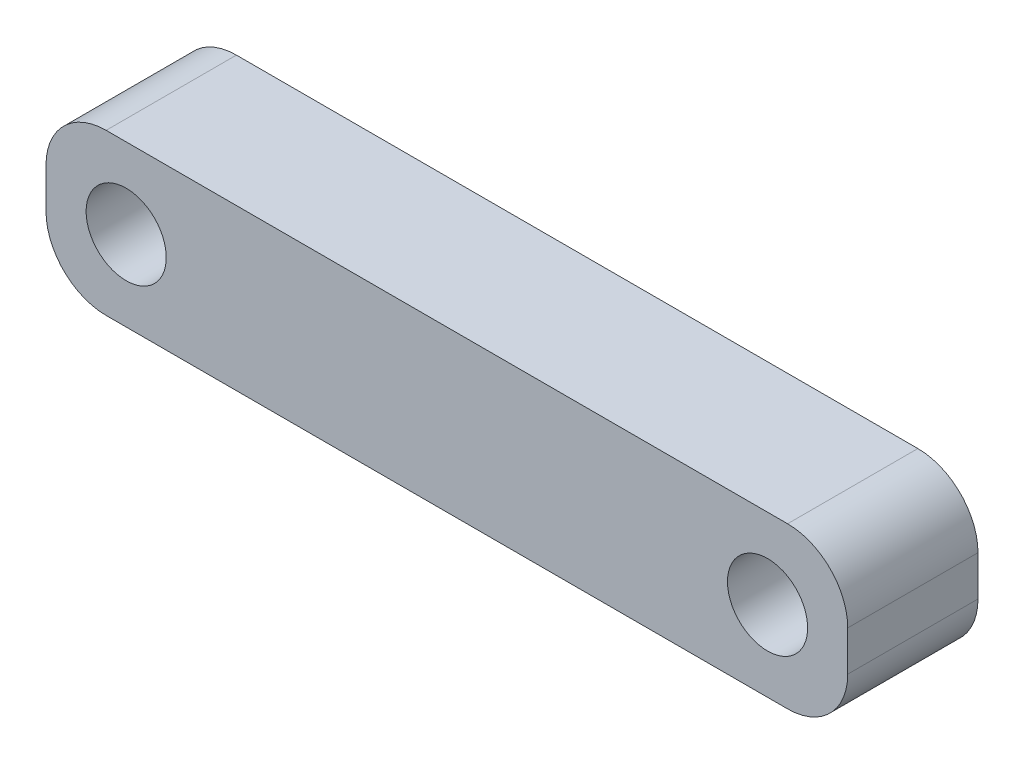
ISO-10303-21;
HEADER;
FILE_DESCRIPTION(('STEP AP214'),'2;1');
FILE_NAME('part.step','',(''),(''),'','','');
FILE_SCHEMA(('AUTOMOTIVE_DESIGN { 1 0 10303 214 1 1 1 1 }'));
ENDSEC;
DATA;
#1=APPLICATION_CONTEXT('core data for automotive mechanical design processes');
#2=APPLICATION_PROTOCOL_DEFINITION('international standard','automotive_design',2000,#1);
#3=PRODUCT_CONTEXT('',#1,'mechanical');
#4=PRODUCT('Part','Part','',(#3));
#5=PRODUCT_RELATED_PRODUCT_CATEGORY('part','',(#4));
#6=PRODUCT_DEFINITION_FORMATION('','',#4);
#7=PRODUCT_DEFINITION_CONTEXT('part definition',#1,'design');
#8=PRODUCT_DEFINITION('design','',#6,#7);
#9=PRODUCT_DEFINITION_SHAPE('','',#8);
#10=(LENGTH_UNIT() NAMED_UNIT(*) SI_UNIT(.MILLI.,.METRE.));
#11=(NAMED_UNIT(*) PLANE_ANGLE_UNIT() SI_UNIT($,.RADIAN.));
#12=(NAMED_UNIT(*) SI_UNIT($,.STERADIAN.) SOLID_ANGLE_UNIT());
#13=UNCERTAINTY_MEASURE_WITH_UNIT(LENGTH_MEASURE(1.E-05),#10,'distance_accuracy_value','');
#14=(GEOMETRIC_REPRESENTATION_CONTEXT(3) GLOBAL_UNCERTAINTY_ASSIGNED_CONTEXT((#13)) GLOBAL_UNIT_ASSIGNED_CONTEXT((#10,
#11,#12)) REPRESENTATION_CONTEXT('',''));
#15=CARTESIAN_POINT('',(0.,0.,0.));
#16=DIRECTION('',(0.,0.,1.));
#17=DIRECTION('',(1.,0.,0.));
#18=AXIS2_PLACEMENT_3D('',#15,#16,#17);
#19=CARTESIAN_POINT('',(34.,-1.99999999999998,13.));
#20=DIRECTION('',(0.,0.,1.));
#21=DIRECTION('',(1.,0.,0.));
#22=AXIS2_PLACEMENT_3D('',#19,#20,#21);
#23=PLANE('',#22);
#24=CARTESIAN_POINT('',(-32.,0.,13.));
#25=DIRECTION('',(0.,0.,1.));
#26=DIRECTION('',(1.,0.,0.));
#27=AXIS2_PLACEMENT_3D('',#24,#25,#26);
#28=CIRCLE('',#27,4.);
#29=CARTESIAN_POINT('',(-36.,0.,13.));
#30=VERTEX_POINT('',#29);
#31=EDGE_CURVE('E134',#30,#30,#28,.T.);
#32=ORIENTED_EDGE('',*,*,#31,.F.);
#33=EDGE_LOOP('',(#32));
#34=FACE_BOUND('',#33,.T.);
#35=CARTESIAN_POINT('',(34.,-1.99999999999998,13.));
#36=DIRECTION('',(0.,0.,1.));
#37=DIRECTION('',(1.,0.,0.));
#38=AXIS2_PLACEMENT_3D('',#35,#36,#37);
#39=CIRCLE('',#38,5.99999999999999);
#40=CARTESIAN_POINT('',(34.,-7.99999999999997,13.));
#41=VERTEX_POINT('',#40);
#42=CARTESIAN_POINT('',(40.,-1.99999999999998,13.));
#43=VERTEX_POINT('',#42);
#44=EDGE_CURVE('E145',#41,#43,#39,.T.);
#45=ORIENTED_EDGE('',*,*,#44,.T.);
#46=DIRECTION('',(0.,1.,0.));
#47=VECTOR('',#46,1.);
#48=CARTESIAN_POINT('',(40.,-1.99999999999998,13.));
#49=LINE('',#48,#47);
#50=CARTESIAN_POINT('',(40.,2.00000000000003,13.));
#51=VERTEX_POINT('',#50);
#52=EDGE_CURVE('E93',#43,#51,#49,.T.);
#53=ORIENTED_EDGE('',*,*,#52,.T.);
#54=CARTESIAN_POINT('',(34.,2.00000000000003,13.));
#55=DIRECTION('',(0.,0.,1.));
#56=DIRECTION('',(-1.,0.,0.));
#57=AXIS2_PLACEMENT_3D('',#54,#55,#56);
#58=CIRCLE('',#57,6.);
#59=CARTESIAN_POINT('',(34.,8.00000000000003,13.));
#60=VERTEX_POINT('',#59);
#61=EDGE_CURVE('E160',#51,#60,#58,.T.);
#62=ORIENTED_EDGE('',*,*,#61,.T.);
#63=DIRECTION('',(-1.,0.,0.));
#64=VECTOR('',#63,1.);
#65=CARTESIAN_POINT('',(-34.,8.00000000000002,13.));
#66=LINE('',#65,#64);
#67=CARTESIAN_POINT('',(-34.,8.00000000000002,13.));
#68=VERTEX_POINT('',#67);
#69=EDGE_CURVE('E173',#60,#68,#66,.T.);
#70=ORIENTED_EDGE('',*,*,#69,.T.);
#71=CARTESIAN_POINT('',(-34.,2.00000000000002,13.));
#72=DIRECTION('',(0.,0.,1.));
#73=DIRECTION('',(-1.,0.,0.));
#74=AXIS2_PLACEMENT_3D('',#71,#72,#73);
#75=CIRCLE('',#74,6.);
#76=CARTESIAN_POINT('',(-40.,2.00000000000002,13.));
#77=VERTEX_POINT('',#76);
#78=EDGE_CURVE('E112',#68,#77,#75,.T.);
#79=ORIENTED_EDGE('',*,*,#78,.T.);
#80=DIRECTION('',(0.,-1.,0.));
#81=VECTOR('',#80,1.);
#82=CARTESIAN_POINT('',(-40.,-1.99999999999999,13.));
#83=LINE('',#82,#81);
#84=CARTESIAN_POINT('',(-40.,-1.99999999999999,13.));
#85=VERTEX_POINT('',#84);
#86=EDGE_CURVE('E106',#77,#85,#83,.T.);
#87=ORIENTED_EDGE('',*,*,#86,.T.);
#88=CARTESIAN_POINT('',(-34.,-1.99999999999999,13.));
#89=DIRECTION('',(0.,0.,1.));
#90=DIRECTION('',(-1.,0.,0.));
#91=AXIS2_PLACEMENT_3D('',#88,#89,#90);
#92=CIRCLE('',#91,5.99999999999999);
#93=CARTESIAN_POINT('',(-34.,-7.99999999999998,13.));
#94=VERTEX_POINT('',#93);
#95=EDGE_CURVE('E110',#85,#94,#92,.T.);
#96=ORIENTED_EDGE('',*,*,#95,.T.);
#97=DIRECTION('',(1.,0.,0.));
#98=VECTOR('',#97,1.);
#99=CARTESIAN_POINT('',(-34.,-7.99999999999998,13.));
#100=LINE('',#99,#98);
#101=EDGE_CURVE('E50',#94,#41,#100,.T.);
#102=ORIENTED_EDGE('',*,*,#101,.T.);
#103=EDGE_LOOP('',(#45,#53,#62,#70,#79,#87,#96,#102));
#104=FACE_BOUND('',#103,.T.);
#105=CARTESIAN_POINT('',(32.,0.,13.));
#106=DIRECTION('',(0.,0.,1.));
#107=DIRECTION('',(-1.,0.,0.));
#108=AXIS2_PLACEMENT_3D('',#105,#106,#107);
#109=CIRCLE('',#108,4.);
#110=CARTESIAN_POINT('',(28.,0.,13.));
#111=VERTEX_POINT('',#110);
#112=EDGE_CURVE('E182',#111,#111,#109,.T.);
#113=ORIENTED_EDGE('',*,*,#112,.F.);
#114=EDGE_LOOP('',(#113));
#115=FACE_BOUND('',#114,.T.);
#116=ADVANCED_FACE('F33',(#34,#104,#115),#23,.T.);
#117=CARTESIAN_POINT('',(34.,-1.99999999999998,0.));
#118=DIRECTION('',(0.,0.,1.));
#119=DIRECTION('',(1.,0.,0.));
#120=AXIS2_PLACEMENT_3D('',#117,#118,#119);
#121=PLANE('',#120);
#122=CARTESIAN_POINT('',(34.,-1.99999999999998,0.));
#123=DIRECTION('',(0.,0.,1.));
#124=DIRECTION('',(1.,0.,0.));
#125=AXIS2_PLACEMENT_3D('',#122,#123,#124);
#126=CIRCLE('',#125,5.99999999999999);
#127=CARTESIAN_POINT('',(34.,-7.99999999999997,0.));
#128=VERTEX_POINT('',#127);
#129=CARTESIAN_POINT('',(40.,-1.99999999999998,0.));
#130=VERTEX_POINT('',#129);
#131=EDGE_CURVE('E130',#128,#130,#126,.T.);
#132=ORIENTED_EDGE('',*,*,#131,.F.);
#133=DIRECTION('',(1.,0.,0.));
#134=VECTOR('',#133,1.);
#135=CARTESIAN_POINT('',(-34.,-7.99999999999998,0.));
#136=LINE('',#135,#134);
#137=CARTESIAN_POINT('',(-34.,-7.99999999999998,0.));
#138=VERTEX_POINT('',#137);
#139=EDGE_CURVE('E85',#138,#128,#136,.T.);
#140=ORIENTED_EDGE('',*,*,#139,.F.);
#141=CARTESIAN_POINT('',(-34.,-1.99999999999999,0.));
#142=DIRECTION('',(0.,0.,1.));
#143=DIRECTION('',(-1.,0.,0.));
#144=AXIS2_PLACEMENT_3D('',#141,#142,#143);
#145=CIRCLE('',#144,5.99999999999999);
#146=CARTESIAN_POINT('',(-40.,-1.99999999999999,0.));
#147=VERTEX_POINT('',#146);
#148=EDGE_CURVE('E79',#147,#138,#145,.T.);
#149=ORIENTED_EDGE('',*,*,#148,.F.);
#150=DIRECTION('',(0.,-1.,0.));
#151=VECTOR('',#150,1.);
#152=CARTESIAN_POINT('',(-40.,-1.99999999999999,0.));
#153=LINE('',#152,#151);
#154=CARTESIAN_POINT('',(-40.,2.00000000000002,0.));
#155=VERTEX_POINT('',#154);
#156=EDGE_CURVE('E120',#155,#147,#153,.T.);
#157=ORIENTED_EDGE('',*,*,#156,.F.);
#158=CARTESIAN_POINT('',(-34.,2.00000000000002,0.));
#159=DIRECTION('',(0.,0.,1.));
#160=DIRECTION('',(-1.,0.,0.));
#161=AXIS2_PLACEMENT_3D('',#158,#159,#160);
#162=CIRCLE('',#161,6.);
#163=CARTESIAN_POINT('',(-34.,8.00000000000002,0.));
#164=VERTEX_POINT('',#163);
#165=EDGE_CURVE('E140',#164,#155,#162,.T.);
#166=ORIENTED_EDGE('',*,*,#165,.F.);
#167=DIRECTION('',(-1.,0.,0.));
#168=VECTOR('',#167,1.);
#169=CARTESIAN_POINT('',(-34.,8.00000000000002,0.));
#170=LINE('',#169,#168);
#171=CARTESIAN_POINT('',(34.,8.00000000000003,0.));
#172=VERTEX_POINT('',#171);
#173=EDGE_CURVE('E138',#172,#164,#170,.T.);
#174=ORIENTED_EDGE('',*,*,#173,.F.);
#175=CARTESIAN_POINT('',(34.,2.00000000000003,0.));
#176=DIRECTION('',(0.,0.,1.));
#177=DIRECTION('',(-1.,0.,0.));
#178=AXIS2_PLACEMENT_3D('',#175,#176,#177);
#179=CIRCLE('',#178,6.);
#180=CARTESIAN_POINT('',(40.,2.00000000000003,0.));
#181=VERTEX_POINT('',#180);
#182=EDGE_CURVE('E136',#181,#172,#179,.T.);
#183=ORIENTED_EDGE('',*,*,#182,.F.);
#184=DIRECTION('',(0.,1.,0.));
#185=VECTOR('',#184,1.);
#186=CARTESIAN_POINT('',(40.,-1.99999999999998,0.));
#187=LINE('',#186,#185);
#188=EDGE_CURVE('E133',#130,#181,#187,.T.);
#189=ORIENTED_EDGE('',*,*,#188,.F.);
#190=EDGE_LOOP('',(#132,#140,#149,#157,#166,#174,#183,#189));
#191=FACE_BOUND('',#190,.T.);
#192=CARTESIAN_POINT('',(-32.,0.,0.));
#193=DIRECTION('',(0.,0.,1.));
#194=DIRECTION('',(1.,0.,0.));
#195=AXIS2_PLACEMENT_3D('',#192,#193,#194);
#196=CIRCLE('',#195,4.);
#197=CARTESIAN_POINT('',(-36.,0.,0.));
#198=VERTEX_POINT('',#197);
#199=EDGE_CURVE('E179',#198,#198,#196,.T.);
#200=ORIENTED_EDGE('',*,*,#199,.T.);
#201=EDGE_LOOP('',(#200));
#202=FACE_BOUND('',#201,.T.);
#203=CARTESIAN_POINT('',(32.,0.,0.));
#204=DIRECTION('',(0.,0.,1.));
#205=DIRECTION('',(-1.,0.,0.));
#206=AXIS2_PLACEMENT_3D('',#203,#204,#205);
#207=CIRCLE('',#206,4.);
#208=CARTESIAN_POINT('',(28.,0.,0.));
#209=VERTEX_POINT('',#208);
#210=EDGE_CURVE('E185',#209,#209,#207,.T.);
#211=ORIENTED_EDGE('',*,*,#210,.T.);
#212=EDGE_LOOP('',(#211));
#213=FACE_BOUND('',#212,.T.);
#214=ADVANCED_FACE('F164',(#191,#202,#213),#121,.F.);
#215=CARTESIAN_POINT('',(34.,-1.99999999999998,13.));
#216=DIRECTION('',(0.,0.,-1.));
#217=DIRECTION('',(-1.,0.,0.));
#218=AXIS2_PLACEMENT_3D('',#215,#216,#217);
#219=CYLINDRICAL_SURFACE('',#218,5.99999999999999);
#220=ORIENTED_EDGE('',*,*,#131,.T.);
#221=DIRECTION('',(0.,0.,-1.));
#222=VECTOR('',#221,1.);
#223=CARTESIAN_POINT('',(40.,-1.99999999999998,13.));
#224=LINE('',#223,#222);
#225=EDGE_CURVE('E11',#43,#130,#224,.T.);
#226=ORIENTED_EDGE('',*,*,#225,.F.);
#227=ORIENTED_EDGE('',*,*,#44,.F.);
#228=DIRECTION('',(0.,0.,-1.));
#229=VECTOR('',#228,1.);
#230=CARTESIAN_POINT('',(34.,-7.99999999999997,13.));
#231=LINE('',#230,#229);
#232=EDGE_CURVE('E126',#41,#128,#231,.T.);
#233=ORIENTED_EDGE('',*,*,#232,.T.);
#234=EDGE_LOOP('',(#220,#226,#227,#233));
#235=FACE_BOUND('',#234,.T.);
#236=ADVANCED_FACE('F35',(#235),#219,.T.);
#237=CARTESIAN_POINT('',(40.,-1.99999999999998,13.));
#238=DIRECTION('',(-1.,0.,0.));
#239=DIRECTION('',(0.,0.,1.));
#240=AXIS2_PLACEMENT_3D('',#237,#238,#239);
#241=PLANE('',#240);
#242=ORIENTED_EDGE('',*,*,#188,.T.);
#243=DIRECTION('',(0.,0.,-1.));
#244=VECTOR('',#243,1.);
#245=CARTESIAN_POINT('',(40.,2.00000000000003,13.));
#246=LINE('',#245,#244);
#247=EDGE_CURVE('E42',#51,#181,#246,.T.);
#248=ORIENTED_EDGE('',*,*,#247,.F.);
#249=ORIENTED_EDGE('',*,*,#52,.F.);
#250=ORIENTED_EDGE('',*,*,#225,.T.);
#251=EDGE_LOOP('',(#242,#248,#249,#250));
#252=FACE_BOUND('',#251,.T.);
#253=ADVANCED_FACE('F217',(#252),#241,.F.);
#254=CARTESIAN_POINT('',(34.,2.00000000000003,13.));
#255=DIRECTION('',(0.,0.,-1.));
#256=DIRECTION('',(-1.,0.,0.));
#257=AXIS2_PLACEMENT_3D('',#254,#255,#256);
#258=CYLINDRICAL_SURFACE('',#257,6.);
#259=ORIENTED_EDGE('',*,*,#182,.T.);
#260=DIRECTION('',(0.,0.,-1.));
#261=VECTOR('',#260,1.);
#262=CARTESIAN_POINT('',(34.,8.00000000000003,13.));
#263=LINE('',#262,#261);
#264=EDGE_CURVE('E152',#60,#172,#263,.T.);
#265=ORIENTED_EDGE('',*,*,#264,.F.);
#266=ORIENTED_EDGE('',*,*,#61,.F.);
#267=ORIENTED_EDGE('',*,*,#247,.T.);
#268=EDGE_LOOP('',(#259,#265,#266,#267));
#269=FACE_BOUND('',#268,.T.);
#270=ADVANCED_FACE('F158',(#269),#258,.T.);
#271=CARTESIAN_POINT('',(-34.,8.00000000000002,13.));
#272=DIRECTION('',(0.,-1.,0.));
#273=DIRECTION('',(1.,0.,0.));
#274=AXIS2_PLACEMENT_3D('',#271,#272,#273);
#275=PLANE('',#274);
#276=ORIENTED_EDGE('',*,*,#173,.T.);
#277=DIRECTION('',(0.,0.,-1.));
#278=VECTOR('',#277,1.);
#279=CARTESIAN_POINT('',(-34.,8.00000000000002,13.));
#280=LINE('',#279,#278);
#281=EDGE_CURVE('E149',#68,#164,#280,.T.);
#282=ORIENTED_EDGE('',*,*,#281,.F.);
#283=ORIENTED_EDGE('',*,*,#69,.F.);
#284=ORIENTED_EDGE('',*,*,#264,.T.);
#285=EDGE_LOOP('',(#276,#282,#283,#284));
#286=FACE_BOUND('',#285,.T.);
#287=ADVANCED_FACE('F169',(#286),#275,.F.);
#288=CARTESIAN_POINT('',(-34.,2.00000000000002,13.));
#289=DIRECTION('',(0.,0.,-1.));
#290=DIRECTION('',(-1.,0.,0.));
#291=AXIS2_PLACEMENT_3D('',#288,#289,#290);
#292=CYLINDRICAL_SURFACE('',#291,6.);
#293=ORIENTED_EDGE('',*,*,#165,.T.);
#294=DIRECTION('',(0.,0.,-1.));
#295=VECTOR('',#294,1.);
#296=CARTESIAN_POINT('',(-40.,2.00000000000002,13.));
#297=LINE('',#296,#295);
#298=EDGE_CURVE('E121',#77,#155,#297,.T.);
#299=ORIENTED_EDGE('',*,*,#298,.F.);
#300=ORIENTED_EDGE('',*,*,#78,.F.);
#301=ORIENTED_EDGE('',*,*,#281,.T.);
#302=EDGE_LOOP('',(#293,#299,#300,#301));
#303=FACE_BOUND('',#302,.T.);
#304=ADVANCED_FACE('F172',(#303),#292,.T.);
#305=CARTESIAN_POINT('',(-40.,-1.99999999999999,13.));
#306=DIRECTION('',(1.,0.,0.));
#307=DIRECTION('',(0.,0.,-1.));
#308=AXIS2_PLACEMENT_3D('',#305,#306,#307);
#309=PLANE('',#308);
#310=ORIENTED_EDGE('',*,*,#156,.T.);
#311=DIRECTION('',(0.,0.,-1.));
#312=VECTOR('',#311,1.);
#313=CARTESIAN_POINT('',(-40.,-1.99999999999999,13.));
#314=LINE('',#313,#312);
#315=EDGE_CURVE('E117',#85,#147,#314,.T.);
#316=ORIENTED_EDGE('',*,*,#315,.F.);
#317=ORIENTED_EDGE('',*,*,#86,.F.);
#318=ORIENTED_EDGE('',*,*,#298,.T.);
#319=EDGE_LOOP('',(#310,#316,#317,#318));
#320=FACE_BOUND('',#319,.T.);
#321=ADVANCED_FACE('F118',(#320),#309,.F.);
#322=CARTESIAN_POINT('',(-34.,-1.99999999999999,13.));
#323=DIRECTION('',(0.,0.,-1.));
#324=DIRECTION('',(-1.,0.,0.));
#325=AXIS2_PLACEMENT_3D('',#322,#323,#324);
#326=CYLINDRICAL_SURFACE('',#325,5.99999999999999);
#327=ORIENTED_EDGE('',*,*,#148,.T.);
#328=DIRECTION('',(0.,0.,-1.));
#329=VECTOR('',#328,1.);
#330=CARTESIAN_POINT('',(-34.,-7.99999999999998,13.));
#331=LINE('',#330,#329);
#332=EDGE_CURVE('E122',#94,#138,#331,.T.);
#333=ORIENTED_EDGE('',*,*,#332,.F.);
#334=ORIENTED_EDGE('',*,*,#95,.F.);
#335=ORIENTED_EDGE('',*,*,#315,.T.);
#336=EDGE_LOOP('',(#327,#333,#334,#335));
#337=FACE_BOUND('',#336,.T.);
#338=ADVANCED_FACE('F124',(#337),#326,.T.);
#339=CARTESIAN_POINT('',(-34.,-7.99999999999998,13.));
#340=DIRECTION('',(0.,1.,0.));
#341=DIRECTION('',(-1.,0.,0.));
#342=AXIS2_PLACEMENT_3D('',#339,#340,#341);
#343=PLANE('',#342);
#344=ORIENTED_EDGE('',*,*,#139,.T.);
#345=ORIENTED_EDGE('',*,*,#232,.F.);
#346=ORIENTED_EDGE('',*,*,#101,.F.);
#347=ORIENTED_EDGE('',*,*,#332,.T.);
#348=EDGE_LOOP('',(#344,#345,#346,#347));
#349=FACE_BOUND('',#348,.T.);
#350=ADVANCED_FACE('F205',(#349),#343,.F.);
#351=CARTESIAN_POINT('',(-32.,0.,13.));
#352=DIRECTION('',(0.,0.,-1.));
#353=DIRECTION('',(-1.,0.,0.));
#354=AXIS2_PLACEMENT_3D('',#351,#352,#353);
#355=CYLINDRICAL_SURFACE('',#354,4.);
#356=CARTESIAN_POINT('',(-36.,0.,13.));
#357=CARTESIAN_POINT('',(-36.,0.,12.8645833333333));
#358=CARTESIAN_POINT('',(-36.,0.,12.7291666666667));
#359=CARTESIAN_POINT('',(-36.,0.,12.4583333333333));
#360=CARTESIAN_POINT('',(-36.,0.,12.3229166666667));
#361=CARTESIAN_POINT('',(-36.,0.,12.0520833333333));
#362=CARTESIAN_POINT('',(-36.,0.,11.9166666666667));
#363=CARTESIAN_POINT('',(-36.,0.,11.6458333333333));
#364=CARTESIAN_POINT('',(-36.,0.,11.5104166666667));
#365=CARTESIAN_POINT('',(-36.,0.,11.2395833333333));
#366=CARTESIAN_POINT('',(-36.,0.,11.1041666666667));
#367=CARTESIAN_POINT('',(-36.,0.,10.8333333333333));
#368=CARTESIAN_POINT('',(-36.,0.,10.6979166666667));
#369=CARTESIAN_POINT('',(-36.,0.,10.4270833333333));
#370=CARTESIAN_POINT('',(-36.,0.,10.2916666666667));
#371=CARTESIAN_POINT('',(-36.,0.,10.0208333333333));
#372=CARTESIAN_POINT('',(-36.,0.,9.88541666666667));
#373=CARTESIAN_POINT('',(-36.,0.,9.61458333333333));
#374=CARTESIAN_POINT('',(-36.,0.,9.47916666666667));
#375=CARTESIAN_POINT('',(-36.,0.,9.20833333333333));
#376=CARTESIAN_POINT('',(-36.,0.,9.07291666666667));
#377=CARTESIAN_POINT('',(-36.,0.,8.80208333333333));
#378=CARTESIAN_POINT('',(-36.,0.,8.66666666666667));
#379=CARTESIAN_POINT('',(-36.,0.,8.39583333333333));
#380=CARTESIAN_POINT('',(-36.,0.,8.26041666666667));
#381=CARTESIAN_POINT('',(-36.,0.,7.98958333333333));
#382=CARTESIAN_POINT('',(-36.,0.,7.85416666666667));
#383=CARTESIAN_POINT('',(-36.,0.,7.58333333333333));
#384=CARTESIAN_POINT('',(-36.,0.,7.44791666666667));
#385=CARTESIAN_POINT('',(-36.,0.,7.17708333333333));
#386=CARTESIAN_POINT('',(-36.,0.,7.04166666666667));
#387=CARTESIAN_POINT('',(-36.,0.,6.77083333333333));
#388=CARTESIAN_POINT('',(-36.,0.,6.63541666666667));
#389=CARTESIAN_POINT('',(-36.,0.,6.36458333333333));
#390=CARTESIAN_POINT('',(-36.,0.,6.22916666666667));
#391=CARTESIAN_POINT('',(-36.,0.,5.95833333333333));
#392=CARTESIAN_POINT('',(-36.,0.,5.82291666666667));
#393=CARTESIAN_POINT('',(-36.,0.,5.55208333333333));
#394=CARTESIAN_POINT('',(-36.,0.,5.41666666666667));
#395=CARTESIAN_POINT('',(-36.,0.,5.14583333333333));
#396=CARTESIAN_POINT('',(-36.,0.,5.01041666666667));
#397=CARTESIAN_POINT('',(-36.,0.,4.73958333333333));
#398=CARTESIAN_POINT('',(-36.,0.,4.60416666666667));
#399=CARTESIAN_POINT('',(-36.,0.,4.33333333333333));
#400=CARTESIAN_POINT('',(-36.,0.,4.19791666666667));
#401=CARTESIAN_POINT('',(-36.,0.,3.92708333333333));
#402=CARTESIAN_POINT('',(-36.,0.,3.79166666666667));
#403=CARTESIAN_POINT('',(-36.,0.,3.52083333333333));
#404=CARTESIAN_POINT('',(-36.,0.,3.38541666666667));
#405=CARTESIAN_POINT('',(-36.,0.,3.11458333333333));
#406=CARTESIAN_POINT('',(-36.,0.,2.97916666666667));
#407=CARTESIAN_POINT('',(-36.,0.,2.70833333333333));
#408=CARTESIAN_POINT('',(-36.,0.,2.57291666666667));
#409=CARTESIAN_POINT('',(-36.,0.,2.30208333333333));
#410=CARTESIAN_POINT('',(-36.,0.,2.16666666666667));
#411=CARTESIAN_POINT('',(-36.,0.,1.89583333333333));
#412=CARTESIAN_POINT('',(-36.,0.,1.76041666666667));
#413=CARTESIAN_POINT('',(-36.,0.,1.48958333333333));
#414=CARTESIAN_POINT('',(-36.,0.,1.35416666666667));
#415=CARTESIAN_POINT('',(-36.,0.,1.08333333333333));
#416=CARTESIAN_POINT('',(-36.,0.,0.947916666666667));
#417=CARTESIAN_POINT('',(-36.,0.,0.677083333333334));
#418=CARTESIAN_POINT('',(-36.,0.,0.541666666666667));
#419=CARTESIAN_POINT('',(-36.,0.,0.270833333333334));
#420=CARTESIAN_POINT('',(-36.,0.,0.135416666666667));
#421=CARTESIAN_POINT('',(-36.,0.,0.));
#422=B_SPLINE_CURVE_WITH_KNOTS('',3,(#356,#357,#358,#359,#360,#361,#362,#363,#364,#365,#366,
#367,#368,#369,#370,#371,#372,#373,#374,#375,#376,#377,#378,#379,#380,#381,#382,#383,#384,#385,
#386,#387,#388,#389,#390,#391,#392,#393,#394,#395,#396,#397,#398,#399,#400,#401,#402,#403,#404,
#405,#406,#407,#408,#409,#410,#411,#412,#413,#414,#415,#416,#417,#418,#419,#420,#421),
.UNSPECIFIED.,.F.,.F.,(4,2,2,2,2,2,2,2,2,2,2,2,2,2,2,2,2,2,2,2,2,2,2,2,2,2,2,2,2,2,2,2,4),(0.,
0.406249999999999,0.812499999999999,1.21875,1.625,2.03125,2.4375,2.84375,3.25,3.65625,4.0625,
4.46875,4.875,5.28125,5.6875,6.09375,6.5,6.90625,7.3125,7.71875,8.125,8.53125,8.9375,9.34375,
9.75,10.15625,10.5625,10.96875,11.375,11.78125,12.1875,12.59375,13.),.UNSPECIFIED.);
#423=EDGE_CURVE('BSEAM202',#30,#198,#422,.T.);
#424=ORIENTED_EDGE('',*,*,#31,.T.);
#425=ORIENTED_EDGE('',*,*,#199,.F.);
#426=ORIENTED_EDGE('',*,*,#423,.T.);
#427=ORIENTED_EDGE('',*,*,#423,.F.);
#428=EDGE_LOOP('',(#424,#426,#425,#427));
#429=FACE_BOUND('',#428,.T.);
#430=ADVANCED_FACE('F202',(#429),#355,.F.);
#431=CARTESIAN_POINT('',(32.,0.,13.));
#432=DIRECTION('',(0.,0.,-1.));
#433=DIRECTION('',(-1.,0.,0.));
#434=AXIS2_PLACEMENT_3D('',#431,#432,#433);
#435=CYLINDRICAL_SURFACE('',#434,4.);
#436=CARTESIAN_POINT('',(28.,0.,13.));
#437=CARTESIAN_POINT('',(28.,0.,12.8645833333333));
#438=CARTESIAN_POINT('',(28.,0.,12.7291666666667));
#439=CARTESIAN_POINT('',(28.,0.,12.4583333333333));
#440=CARTESIAN_POINT('',(28.,0.,12.3229166666667));
#441=CARTESIAN_POINT('',(28.,0.,12.0520833333333));
#442=CARTESIAN_POINT('',(28.,0.,11.9166666666667));
#443=CARTESIAN_POINT('',(28.,0.,11.6458333333333));
#444=CARTESIAN_POINT('',(28.,0.,11.5104166666667));
#445=CARTESIAN_POINT('',(28.,0.,11.2395833333333));
#446=CARTESIAN_POINT('',(28.,0.,11.1041666666667));
#447=CARTESIAN_POINT('',(28.,0.,10.8333333333333));
#448=CARTESIAN_POINT('',(28.,0.,10.6979166666667));
#449=CARTESIAN_POINT('',(28.,0.,10.4270833333333));
#450=CARTESIAN_POINT('',(28.,0.,10.2916666666667));
#451=CARTESIAN_POINT('',(28.,0.,10.0208333333333));
#452=CARTESIAN_POINT('',(28.,0.,9.88541666666667));
#453=CARTESIAN_POINT('',(28.,0.,9.61458333333333));
#454=CARTESIAN_POINT('',(28.,0.,9.47916666666667));
#455=CARTESIAN_POINT('',(28.,0.,9.20833333333333));
#456=CARTESIAN_POINT('',(28.,0.,9.07291666666667));
#457=CARTESIAN_POINT('',(28.,0.,8.80208333333333));
#458=CARTESIAN_POINT('',(28.,0.,8.66666666666667));
#459=CARTESIAN_POINT('',(28.,0.,8.39583333333333));
#460=CARTESIAN_POINT('',(28.,0.,8.26041666666667));
#461=CARTESIAN_POINT('',(28.,0.,7.98958333333333));
#462=CARTESIAN_POINT('',(28.,0.,7.85416666666667));
#463=CARTESIAN_POINT('',(28.,0.,7.58333333333333));
#464=CARTESIAN_POINT('',(28.,0.,7.44791666666667));
#465=CARTESIAN_POINT('',(28.,0.,7.17708333333333));
#466=CARTESIAN_POINT('',(28.,0.,7.04166666666667));
#467=CARTESIAN_POINT('',(28.,0.,6.77083333333333));
#468=CARTESIAN_POINT('',(28.,0.,6.63541666666667));
#469=CARTESIAN_POINT('',(28.,0.,6.36458333333333));
#470=CARTESIAN_POINT('',(28.,0.,6.22916666666667));
#471=CARTESIAN_POINT('',(28.,0.,5.95833333333333));
#472=CARTESIAN_POINT('',(28.,0.,5.82291666666667));
#473=CARTESIAN_POINT('',(28.,0.,5.55208333333333));
#474=CARTESIAN_POINT('',(28.,0.,5.41666666666667));
#475=CARTESIAN_POINT('',(28.,0.,5.14583333333333));
#476=CARTESIAN_POINT('',(28.,0.,5.01041666666667));
#477=CARTESIAN_POINT('',(28.,0.,4.73958333333333));
#478=CARTESIAN_POINT('',(28.,0.,4.60416666666667));
#479=CARTESIAN_POINT('',(28.,0.,4.33333333333333));
#480=CARTESIAN_POINT('',(28.,0.,4.19791666666667));
#481=CARTESIAN_POINT('',(28.,0.,3.92708333333333));
#482=CARTESIAN_POINT('',(28.,0.,3.79166666666667));
#483=CARTESIAN_POINT('',(28.,0.,3.52083333333333));
#484=CARTESIAN_POINT('',(28.,0.,3.38541666666667));
#485=CARTESIAN_POINT('',(28.,0.,3.11458333333333));
#486=CARTESIAN_POINT('',(28.,0.,2.97916666666667));
#487=CARTESIAN_POINT('',(28.,0.,2.70833333333333));
#488=CARTESIAN_POINT('',(28.,0.,2.57291666666667));
#489=CARTESIAN_POINT('',(28.,0.,2.30208333333333));
#490=CARTESIAN_POINT('',(28.,0.,2.16666666666667));
#491=CARTESIAN_POINT('',(28.,0.,1.89583333333333));
#492=CARTESIAN_POINT('',(28.,0.,1.76041666666667));
#493=CARTESIAN_POINT('',(28.,0.,1.48958333333333));
#494=CARTESIAN_POINT('',(28.,0.,1.35416666666667));
#495=CARTESIAN_POINT('',(28.,0.,1.08333333333333));
#496=CARTESIAN_POINT('',(28.,0.,0.947916666666667));
#497=CARTESIAN_POINT('',(28.,0.,0.677083333333334));
#498=CARTESIAN_POINT('',(28.,0.,0.541666666666667));
#499=CARTESIAN_POINT('',(28.,0.,0.270833333333334));
#500=CARTESIAN_POINT('',(28.,0.,0.135416666666667));
#501=CARTESIAN_POINT('',(28.,0.,0.));
#502=B_SPLINE_CURVE_WITH_KNOTS('',3,(#436,#437,#438,#439,#440,#441,#442,#443,#444,#445,#446,
#447,#448,#449,#450,#451,#452,#453,#454,#455,#456,#457,#458,#459,#460,#461,#462,#463,#464,#465,
#466,#467,#468,#469,#470,#471,#472,#473,#474,#475,#476,#477,#478,#479,#480,#481,#482,#483,#484,
#485,#486,#487,#488,#489,#490,#491,#492,#493,#494,#495,#496,#497,#498,#499,#500,#501),
.UNSPECIFIED.,.F.,.F.,(4,2,2,2,2,2,2,2,2,2,2,2,2,2,2,2,2,2,2,2,2,2,2,2,2,2,2,2,2,2,2,2,4),(0.,
0.406249999999999,0.812499999999999,1.21875,1.625,2.03125,2.4375,2.84375,3.25,3.65625,4.0625,
4.46875,4.875,5.28125,5.6875,6.09375,6.5,6.90625,7.3125,7.71875,8.125,8.53125,8.9375,9.34375,
9.75,10.15625,10.5625,10.96875,11.375,11.78125,12.1875,12.59375,13.),.UNSPECIFIED.);
#503=EDGE_CURVE('BSEAM191',#111,#209,#502,.T.);
#504=ORIENTED_EDGE('',*,*,#112,.T.);
#505=ORIENTED_EDGE('',*,*,#210,.F.);
#506=ORIENTED_EDGE('',*,*,#503,.T.);
#507=ORIENTED_EDGE('',*,*,#503,.F.);
#508=EDGE_LOOP('',(#504,#506,#505,#507));
#509=FACE_BOUND('',#508,.T.);
#510=ADVANCED_FACE('F191',(#509),#435,.F.);
#511=CLOSED_SHELL('',(#116,#214,#236,#253,#270,#287,#304,#321,#338,#350,#430,#510));
#512=MANIFOLD_SOLID_BREP('B2',#511);
#513=ADVANCED_BREP_SHAPE_REPRESENTATION('',(#18,#512),#14);
#514=SHAPE_DEFINITION_REPRESENTATION(#9,#513);
ENDSEC;
END-ISO-10303-21;
